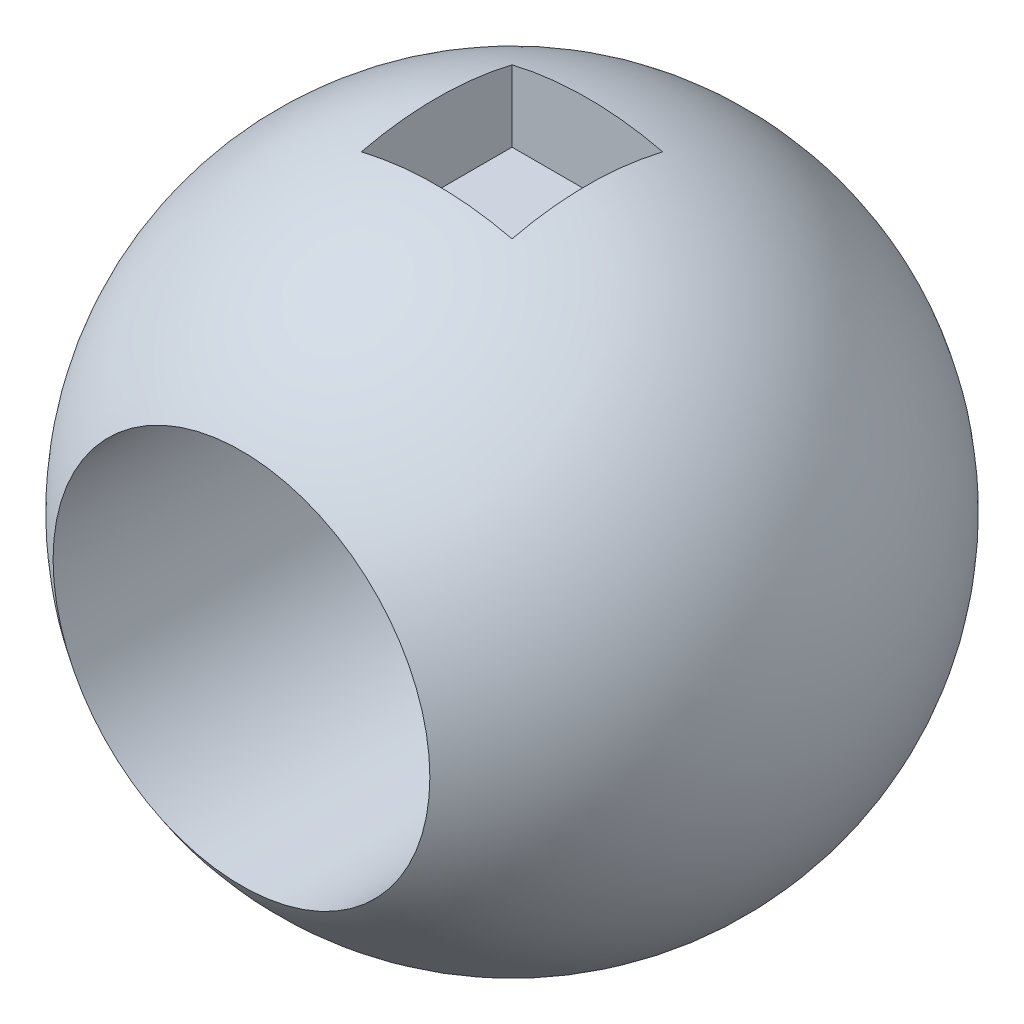
ISO-10303-21;
HEADER;
FILE_DESCRIPTION(('STEP AP214'),'2;1');
FILE_NAME('part.step','',(''),(''),'','','');
FILE_SCHEMA(('AUTOMOTIVE_DESIGN { 1 0 10303 214 1 1 1 1 }'));
ENDSEC;
DATA;
#1=APPLICATION_CONTEXT('core data for automotive mechanical design processes');
#2=APPLICATION_PROTOCOL_DEFINITION('international standard','automotive_design',2000,#1);
#3=PRODUCT_CONTEXT('',#1,'mechanical');
#4=PRODUCT('Part','Part','',(#3));
#5=PRODUCT_RELATED_PRODUCT_CATEGORY('part','',(#4));
#6=PRODUCT_DEFINITION_FORMATION('','',#4);
#7=PRODUCT_DEFINITION_CONTEXT('part definition',#1,'design');
#8=PRODUCT_DEFINITION('design','',#6,#7);
#9=PRODUCT_DEFINITION_SHAPE('','',#8);
#10=(LENGTH_UNIT() NAMED_UNIT(*) SI_UNIT(.MILLI.,.METRE.));
#11=(NAMED_UNIT(*) PLANE_ANGLE_UNIT() SI_UNIT($,.RADIAN.));
#12=(NAMED_UNIT(*) SI_UNIT($,.STERADIAN.) SOLID_ANGLE_UNIT());
#13=UNCERTAINTY_MEASURE_WITH_UNIT(LENGTH_MEASURE(1.E-05),#10,'distance_accuracy_value','');
#14=(GEOMETRIC_REPRESENTATION_CONTEXT(3) GLOBAL_UNCERTAINTY_ASSIGNED_CONTEXT((#13)) GLOBAL_UNIT_ASSIGNED_CONTEXT((#10,
#11,#12)) REPRESENTATION_CONTEXT('',''));
#15=CARTESIAN_POINT('',(0.,0.,0.));
#16=DIRECTION('',(0.,0.,1.));
#17=DIRECTION('',(1.,0.,0.));
#18=AXIS2_PLACEMENT_3D('',#15,#16,#17);
#19=CARTESIAN_POINT('',(0.,0.,0.));
#20=DIRECTION('',(0.,0.,-1.));
#21=DIRECTION('',(-1.,0.,0.));
#22=AXIS2_PLACEMENT_3D('',#19,#20,#21);
#23=SPHERICAL_SURFACE('',#22,22.225);
#24=CARTESIAN_POINT('',(-5.08,0.,0.));
#25=DIRECTION('',(-1.,0.,0.));
#26=DIRECTION('',(0.,0.,1.));
#27=AXIS2_PLACEMENT_3D('',#24,#25,#26);
#28=CIRCLE('',#27,21.636640797499);
#29=CARTESIAN_POINT('',(-5.08,21.0318288553326,-5.08));
#30=VERTEX_POINT('',#29);
#31=CARTESIAN_POINT('',(-5.08,21.0318288553326,5.08));
#32=VERTEX_POINT('',#31);
#33=EDGE_CURVE('E193',#30,#32,#28,.F.);
#34=ORIENTED_EDGE('',*,*,#33,.F.);
#35=CARTESIAN_POINT('',(0.,0.,-5.08));
#36=DIRECTION('',(0.,0.,-1.));
#37=DIRECTION('',(-1.,0.,0.));
#38=AXIS2_PLACEMENT_3D('',#35,#36,#37);
#39=CIRCLE('',#38,21.636640797499);
#40=CARTESIAN_POINT('',(5.08,21.0318288553326,-5.08));
#41=VERTEX_POINT('',#40);
#42=EDGE_CURVE('E190',#41,#30,#39,.F.);
#43=ORIENTED_EDGE('',*,*,#42,.F.);
#44=CARTESIAN_POINT('',(5.08,0.,0.));
#45=DIRECTION('',(1.,0.,0.));
#46=DIRECTION('',(0.,0.,-1.));
#47=AXIS2_PLACEMENT_3D('',#44,#45,#46);
#48=CIRCLE('',#47,21.636640797499);
#49=CARTESIAN_POINT('',(5.08,21.0318288553326,5.08));
#50=VERTEX_POINT('',#49);
#51=EDGE_CURVE('E187',#50,#41,#48,.F.);
#52=ORIENTED_EDGE('',*,*,#51,.F.);
#53=CARTESIAN_POINT('',(0.,0.,5.08));
#54=DIRECTION('',(0.,0.,1.));
#55=DIRECTION('',(1.,0.,0.));
#56=AXIS2_PLACEMENT_3D('',#53,#54,#55);
#57=CIRCLE('',#56,21.636640797499);
#58=EDGE_CURVE('E184',#32,#50,#57,.F.);
#59=ORIENTED_EDGE('',*,*,#58,.F.);
#60=EDGE_LOOP('',(#34,#43,#52,#59));
#61=FACE_BOUND('',#60,.T.);
#62=CARTESIAN_POINT('',(0.,0.,18.2389864027582));
#63=DIRECTION('',(0.,0.,-1.));
#64=DIRECTION('',(-1.,0.,0.));
#65=AXIS2_PLACEMENT_3D('',#62,#63,#64);
#66=CIRCLE('',#65,12.7);
#67=CARTESIAN_POINT('',(-12.7,0.,18.2389864027582));
#68=VERTEX_POINT('',#67);
#69=EDGE_CURVE('E180',#68,#68,#66,.F.);
#70=ORIENTED_EDGE('',*,*,#69,.F.);
#71=EDGE_LOOP('',(#70));
#72=FACE_BOUND('',#71,.T.);
#73=CARTESIAN_POINT('',(0.,0.,-18.2389864027582));
#74=DIRECTION('',(0.,0.,1.));
#75=DIRECTION('',(1.,0.,0.));
#76=AXIS2_PLACEMENT_3D('',#73,#74,#75);
#77=CIRCLE('',#76,12.7);
#78=CARTESIAN_POINT('',(12.7,0.,-18.2389864027582));
#79=VERTEX_POINT('',#78);
#80=EDGE_CURVE('E166',#79,#79,#77,.F.);
#81=ORIENTED_EDGE('',*,*,#80,.F.);
#82=EDGE_LOOP('',(#81));
#83=FACE_BOUND('',#82,.T.);
#84=CARTESIAN_POINT('',(0.,0.,-5.08));
#85=DIRECTION('',(0.,0.,1.));
#86=DIRECTION('',(1.,0.,0.));
#87=AXIS2_PLACEMENT_3D('',#84,#85,#86);
#88=CIRCLE('',#87,21.636640797499);
#89=CARTESIAN_POINT('',(5.08,-21.0318288553326,-5.08));
#90=VERTEX_POINT('',#89);
#91=CARTESIAN_POINT('',(-5.08,-21.0318288553326,-5.08));
#92=VERTEX_POINT('',#91);
#93=EDGE_CURVE('E196',#90,#92,#88,.F.);
#94=ORIENTED_EDGE('',*,*,#93,.T.);
#95=CARTESIAN_POINT('',(-5.08,0.,0.));
#96=DIRECTION('',(1.,0.,0.));
#97=DIRECTION('',(0.,0.,-1.));
#98=AXIS2_PLACEMENT_3D('',#95,#96,#97);
#99=CIRCLE('',#98,21.636640797499);
#100=CARTESIAN_POINT('',(-5.08,-21.0318288553326,5.08));
#101=VERTEX_POINT('',#100);
#102=EDGE_CURVE('E11',#92,#101,#99,.F.);
#103=ORIENTED_EDGE('',*,*,#102,.T.);
#104=CARTESIAN_POINT('',(0.,0.,5.08));
#105=DIRECTION('',(0.,0.,-1.));
#106=DIRECTION('',(-1.,0.,0.));
#107=AXIS2_PLACEMENT_3D('',#104,#105,#106);
#108=CIRCLE('',#107,21.636640797499);
#109=CARTESIAN_POINT('',(5.08,-21.0318288553326,5.08));
#110=VERTEX_POINT('',#109);
#111=EDGE_CURVE('E53',#101,#110,#108,.F.);
#112=ORIENTED_EDGE('',*,*,#111,.T.);
#113=CARTESIAN_POINT('',(5.08,0.,0.));
#114=DIRECTION('',(-1.,0.,0.));
#115=DIRECTION('',(0.,0.,1.));
#116=AXIS2_PLACEMENT_3D('',#113,#114,#115);
#117=CIRCLE('',#116,21.636640797499);
#118=EDGE_CURVE('E199',#110,#90,#117,.F.);
#119=ORIENTED_EDGE('',*,*,#118,.T.);
#120=EDGE_LOOP('',(#94,#103,#112,#119));
#121=FACE_BOUND('',#120,.T.);
#122=ADVANCED_FACE('F45',(#61,#72,#83,#121),#23,.T.);
#123=CARTESIAN_POINT('',(0.,0.,-18.7069672849449));
#124=DIRECTION('',(0.,0.,1.));
#125=DIRECTION('',(1.,0.,0.));
#126=AXIS2_PLACEMENT_3D('',#123,#124,#125);
#127=CYLINDRICAL_SURFACE('',#126,12.7);
#128=ORIENTED_EDGE('',*,*,#69,.T.);
#129=EDGE_LOOP('',(#128));
#130=FACE_BOUND('',#129,.T.);
#131=ORIENTED_EDGE('',*,*,#80,.T.);
#132=EDGE_LOOP('',(#131));
#133=FACE_BOUND('',#132,.T.);
#134=ADVANCED_FACE('F219',(#130,#133),#127,.F.);
#135=CARTESIAN_POINT('',(-5.08,16.225,5.08));
#136=DIRECTION('',(-1.,0.,0.));
#137=DIRECTION('',(0.,0.,1.));
#138=AXIS2_PLACEMENT_3D('',#135,#136,#137);
#139=PLANE('',#138);
#140=ORIENTED_EDGE('',*,*,#33,.T.);
#141=DIRECTION('',(0.,1.,0.));
#142=VECTOR('',#141,1.);
#143=CARTESIAN_POINT('',(-5.08,16.225,5.08));
#144=LINE('',#143,#142);
#145=CARTESIAN_POINT('',(-5.08,16.225,5.08));
#146=VERTEX_POINT('',#145);
#147=EDGE_CURVE('E68',#146,#32,#144,.T.);
#148=ORIENTED_EDGE('',*,*,#147,.F.);
#149=DIRECTION('',(0.,0.,1.));
#150=VECTOR('',#149,1.);
#151=CARTESIAN_POINT('',(-5.08,16.225,5.08));
#152=LINE('',#151,#150);
#153=CARTESIAN_POINT('',(-5.08,16.225,-5.08));
#154=VERTEX_POINT('',#153);
#155=EDGE_CURVE('E140',#154,#146,#152,.T.);
#156=ORIENTED_EDGE('',*,*,#155,.F.);
#157=DIRECTION('',(0.,1.,0.));
#158=VECTOR('',#157,1.);
#159=CARTESIAN_POINT('',(-5.08,16.225,-5.08));
#160=LINE('',#159,#158);
#161=EDGE_CURVE('E162',#154,#30,#160,.T.);
#162=ORIENTED_EDGE('',*,*,#161,.T.);
#163=EDGE_LOOP('',(#140,#148,#156,#162));
#164=FACE_BOUND('',#163,.T.);
#165=ADVANCED_FACE('F226',(#164),#139,.F.);
#166=CARTESIAN_POINT('',(5.08,16.225,-5.08));
#167=DIRECTION('',(0.,0.,-1.));
#168=DIRECTION('',(-1.,0.,0.));
#169=AXIS2_PLACEMENT_3D('',#166,#167,#168);
#170=PLANE('',#169);
#171=ORIENTED_EDGE('',*,*,#42,.T.);
#172=ORIENTED_EDGE('',*,*,#161,.F.);
#173=DIRECTION('',(-1.,0.,0.));
#174=VECTOR('',#173,1.);
#175=CARTESIAN_POINT('',(5.08,16.225,-5.08));
#176=LINE('',#175,#174);
#177=CARTESIAN_POINT('',(5.08,16.225,-5.08));
#178=VERTEX_POINT('',#177);
#179=EDGE_CURVE('E158',#178,#154,#176,.T.);
#180=ORIENTED_EDGE('',*,*,#179,.F.);
#181=DIRECTION('',(0.,1.,0.));
#182=VECTOR('',#181,1.);
#183=CARTESIAN_POINT('',(5.08,16.225,-5.08));
#184=LINE('',#183,#182);
#185=EDGE_CURVE('E167',#178,#41,#184,.T.);
#186=ORIENTED_EDGE('',*,*,#185,.T.);
#187=EDGE_LOOP('',(#171,#172,#180,#186));
#188=FACE_BOUND('',#187,.T.);
#189=ADVANCED_FACE('F241',(#188),#170,.F.);
#190=CARTESIAN_POINT('',(5.08,16.225,5.08));
#191=DIRECTION('',(1.,0.,0.));
#192=DIRECTION('',(0.,0.,-1.));
#193=AXIS2_PLACEMENT_3D('',#190,#191,#192);
#194=PLANE('',#193);
#195=ORIENTED_EDGE('',*,*,#51,.T.);
#196=ORIENTED_EDGE('',*,*,#185,.F.);
#197=DIRECTION('',(0.,0.,-1.));
#198=VECTOR('',#197,1.);
#199=CARTESIAN_POINT('',(5.08,16.225,5.08));
#200=LINE('',#199,#198);
#201=CARTESIAN_POINT('',(5.08,16.225,5.08));
#202=VERTEX_POINT('',#201);
#203=EDGE_CURVE('E154',#202,#178,#200,.T.);
#204=ORIENTED_EDGE('',*,*,#203,.F.);
#205=DIRECTION('',(0.,1.,0.));
#206=VECTOR('',#205,1.);
#207=CARTESIAN_POINT('',(5.08,16.225,5.08));
#208=LINE('',#207,#206);
#209=EDGE_CURVE('E171',#202,#50,#208,.T.);
#210=ORIENTED_EDGE('',*,*,#209,.T.);
#211=EDGE_LOOP('',(#195,#196,#204,#210));
#212=FACE_BOUND('',#211,.T.);
#213=ADVANCED_FACE('F244',(#212),#194,.F.);
#214=CARTESIAN_POINT('',(5.08,16.225,5.08));
#215=DIRECTION('',(0.,0.,1.));
#216=DIRECTION('',(1.,0.,0.));
#217=AXIS2_PLACEMENT_3D('',#214,#215,#216);
#218=PLANE('',#217);
#219=ORIENTED_EDGE('',*,*,#58,.T.);
#220=ORIENTED_EDGE('',*,*,#209,.F.);
#221=DIRECTION('',(1.,0.,0.));
#222=VECTOR('',#221,1.);
#223=CARTESIAN_POINT('',(5.08,16.225,5.08));
#224=LINE('',#223,#222);
#225=EDGE_CURVE('E150',#146,#202,#224,.T.);
#226=ORIENTED_EDGE('',*,*,#225,.F.);
#227=ORIENTED_EDGE('',*,*,#147,.T.);
#228=EDGE_LOOP('',(#219,#220,#226,#227));
#229=FACE_BOUND('',#228,.T.);
#230=ADVANCED_FACE('F247',(#229),#218,.F.);
#231=CARTESIAN_POINT('',(0.,16.225,0.));
#232=DIRECTION('',(0.,1.,0.));
#233=DIRECTION('',(0.,0.,1.));
#234=AXIS2_PLACEMENT_3D('',#231,#232,#233);
#235=PLANE('',#234);
#236=ORIENTED_EDGE('',*,*,#155,.T.);
#237=ORIENTED_EDGE('',*,*,#225,.T.);
#238=ORIENTED_EDGE('',*,*,#203,.T.);
#239=ORIENTED_EDGE('',*,*,#179,.T.);
#240=EDGE_LOOP('',(#236,#237,#238,#239));
#241=FACE_BOUND('',#240,.T.);
#242=ADVANCED_FACE('F246',(#241),#235,.T.);
#243=CARTESIAN_POINT('',(-5.08,-16.225,5.08));
#244=DIRECTION('',(1.,0.,0.));
#245=DIRECTION('',(0.,0.,-1.));
#246=AXIS2_PLACEMENT_3D('',#243,#244,#245);
#247=PLANE('',#246);
#248=DIRECTION('',(0.,-1.,0.));
#249=VECTOR('',#248,1.);
#250=CARTESIAN_POINT('',(-5.08,-16.225,-5.08));
#251=LINE('',#250,#249);
#252=CARTESIAN_POINT('',(-5.08,-16.225,-5.08));
#253=VERTEX_POINT('',#252);
#254=EDGE_CURVE('E60',#253,#92,#251,.T.);
#255=ORIENTED_EDGE('',*,*,#254,.F.);
#256=DIRECTION('',(0.,0.,1.));
#257=VECTOR('',#256,1.);
#258=CARTESIAN_POINT('',(-5.08,-16.225,5.08));
#259=LINE('',#258,#257);
#260=CARTESIAN_POINT('',(-5.08,-16.225,5.08));
#261=VERTEX_POINT('',#260);
#262=EDGE_CURVE('E118',#253,#261,#259,.T.);
#263=ORIENTED_EDGE('',*,*,#262,.T.);
#264=DIRECTION('',(0.,-1.,0.));
#265=VECTOR('',#264,1.);
#266=CARTESIAN_POINT('',(-5.08,-16.225,5.08));
#267=LINE('',#266,#265);
#268=EDGE_CURVE('E137',#261,#101,#267,.T.);
#269=ORIENTED_EDGE('',*,*,#268,.T.);
#270=ORIENTED_EDGE('',*,*,#102,.F.);
#271=EDGE_LOOP('',(#255,#263,#269,#270));
#272=FACE_BOUND('',#271,.T.);
#273=ADVANCED_FACE('F122',(#272),#247,.T.);
#274=CARTESIAN_POINT('',(5.08,-16.225,5.08));
#275=DIRECTION('',(0.,0.,-1.));
#276=DIRECTION('',(-1.,0.,0.));
#277=AXIS2_PLACEMENT_3D('',#274,#275,#276);
#278=PLANE('',#277);
#279=ORIENTED_EDGE('',*,*,#268,.F.);
#280=DIRECTION('',(1.,0.,0.));
#281=VECTOR('',#280,1.);
#282=CARTESIAN_POINT('',(5.08,-16.225,5.08));
#283=LINE('',#282,#281);
#284=CARTESIAN_POINT('',(5.08,-16.225,5.08));
#285=VERTEX_POINT('',#284);
#286=EDGE_CURVE('E127',#261,#285,#283,.T.);
#287=ORIENTED_EDGE('',*,*,#286,.T.);
#288=DIRECTION('',(0.,-1.,0.));
#289=VECTOR('',#288,1.);
#290=CARTESIAN_POINT('',(5.08,-16.225,5.08));
#291=LINE('',#290,#289);
#292=EDGE_CURVE('E141',#285,#110,#291,.T.);
#293=ORIENTED_EDGE('',*,*,#292,.T.);
#294=ORIENTED_EDGE('',*,*,#111,.F.);
#295=EDGE_LOOP('',(#279,#287,#293,#294));
#296=FACE_BOUND('',#295,.T.);
#297=ADVANCED_FACE('F206',(#296),#278,.T.);
#298=CARTESIAN_POINT('',(5.08,-16.225,5.08));
#299=DIRECTION('',(-1.,0.,0.));
#300=DIRECTION('',(0.,0.,1.));
#301=AXIS2_PLACEMENT_3D('',#298,#299,#300);
#302=PLANE('',#301);
#303=ORIENTED_EDGE('',*,*,#292,.F.);
#304=DIRECTION('',(0.,0.,-1.));
#305=VECTOR('',#304,1.);
#306=CARTESIAN_POINT('',(5.08,-16.225,5.08));
#307=LINE('',#306,#305);
#308=CARTESIAN_POINT('',(5.08,-16.225,-5.08));
#309=VERTEX_POINT('',#308);
#310=EDGE_CURVE('E117',#285,#309,#307,.T.);
#311=ORIENTED_EDGE('',*,*,#310,.T.);
#312=DIRECTION('',(0.,-1.,0.));
#313=VECTOR('',#312,1.);
#314=CARTESIAN_POINT('',(5.08,-16.225,-5.08));
#315=LINE('',#314,#313);
#316=EDGE_CURVE('E112',#309,#90,#315,.T.);
#317=ORIENTED_EDGE('',*,*,#316,.T.);
#318=ORIENTED_EDGE('',*,*,#118,.F.);
#319=EDGE_LOOP('',(#303,#311,#317,#318));
#320=FACE_BOUND('',#319,.T.);
#321=ADVANCED_FACE('F209',(#320),#302,.T.);
#322=CARTESIAN_POINT('',(5.08,-16.225,-5.08));
#323=DIRECTION('',(0.,0.,1.));
#324=DIRECTION('',(1.,0.,0.));
#325=AXIS2_PLACEMENT_3D('',#322,#323,#324);
#326=PLANE('',#325);
#327=ORIENTED_EDGE('',*,*,#316,.F.);
#328=DIRECTION('',(-1.,0.,0.));
#329=VECTOR('',#328,1.);
#330=CARTESIAN_POINT('',(5.08,-16.225,-5.08));
#331=LINE('',#330,#329);
#332=EDGE_CURVE('E109',#309,#253,#331,.T.);
#333=ORIENTED_EDGE('',*,*,#332,.T.);
#334=ORIENTED_EDGE('',*,*,#254,.T.);
#335=ORIENTED_EDGE('',*,*,#93,.F.);
#336=EDGE_LOOP('',(#327,#333,#334,#335));
#337=FACE_BOUND('',#336,.T.);
#338=ADVANCED_FACE('F110',(#337),#326,.T.);
#339=CARTESIAN_POINT('',(0.,-16.225,0.));
#340=DIRECTION('',(0.,-1.,0.));
#341=DIRECTION('',(0.,0.,1.));
#342=AXIS2_PLACEMENT_3D('',#339,#340,#341);
#343=PLANE('',#342);
#344=ORIENTED_EDGE('',*,*,#262,.F.);
#345=ORIENTED_EDGE('',*,*,#332,.F.);
#346=ORIENTED_EDGE('',*,*,#310,.F.);
#347=ORIENTED_EDGE('',*,*,#286,.F.);
#348=EDGE_LOOP('',(#344,#345,#346,#347));
#349=FACE_BOUND('',#348,.T.);
#350=ADVANCED_FACE('F129',(#349),#343,.T.);
#351=CLOSED_SHELL('',(#122,#134,#165,#189,#213,#230,#242,#273,#297,#321,#338,#350));
#352=MANIFOLD_SOLID_BREP('B2',#351);
#353=ADVANCED_BREP_SHAPE_REPRESENTATION('',(#18,#352),#14);
#354=SHAPE_DEFINITION_REPRESENTATION(#9,#353);
ENDSEC;
END-ISO-10303-21;
